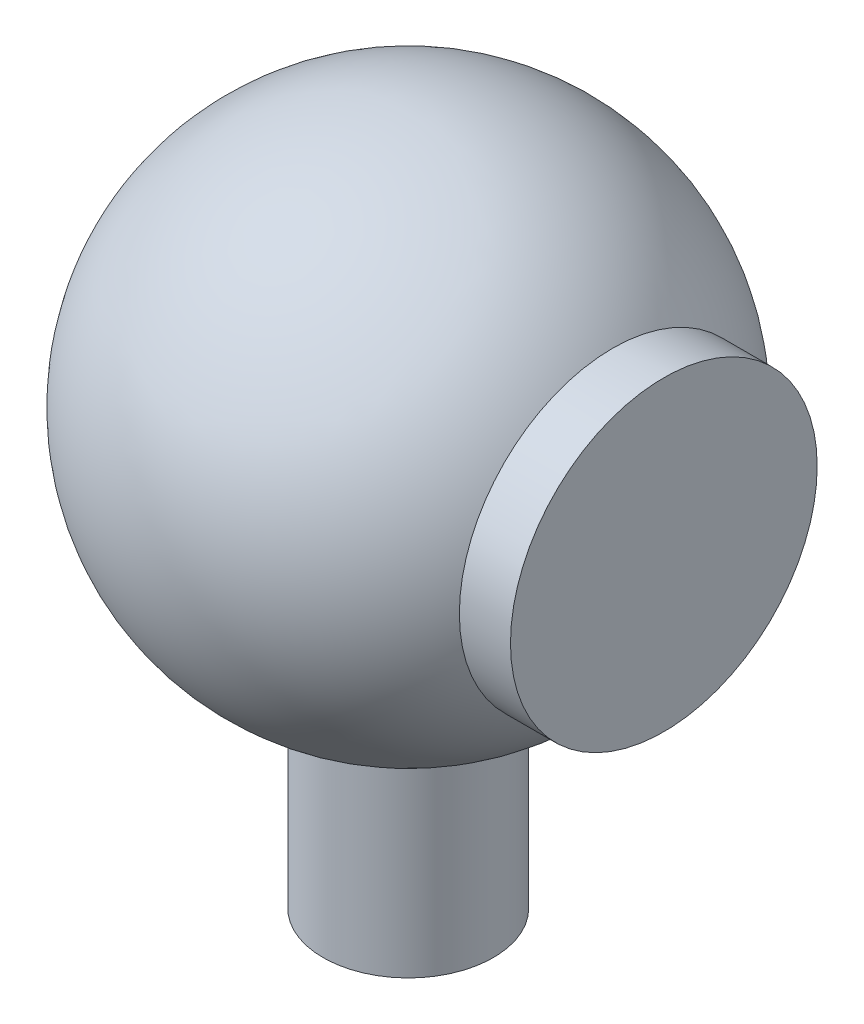
ISO-10303-21;
HEADER;
FILE_DESCRIPTION(('STEP AP214'),'2;1');
FILE_NAME('part.step','',(''),(''),'','','');
FILE_SCHEMA(('AUTOMOTIVE_DESIGN { 1 0 10303 214 1 1 1 1 }'));
ENDSEC;
DATA;
#1=APPLICATION_CONTEXT('core data for automotive mechanical design processes');
#2=APPLICATION_PROTOCOL_DEFINITION('international standard','automotive_design',2000,#1);
#3=PRODUCT_CONTEXT('',#1,'mechanical');
#4=PRODUCT('Part','Part','',(#3));
#5=PRODUCT_RELATED_PRODUCT_CATEGORY('part','',(#4));
#6=PRODUCT_DEFINITION_FORMATION('','',#4);
#7=PRODUCT_DEFINITION_CONTEXT('part definition',#1,'design');
#8=PRODUCT_DEFINITION('design','',#6,#7);
#9=PRODUCT_DEFINITION_SHAPE('','',#8);
#10=(LENGTH_UNIT() NAMED_UNIT(*) SI_UNIT(.MILLI.,.METRE.));
#11=(NAMED_UNIT(*) PLANE_ANGLE_UNIT() SI_UNIT($,.RADIAN.));
#12=(NAMED_UNIT(*) SI_UNIT($,.STERADIAN.) SOLID_ANGLE_UNIT());
#13=UNCERTAINTY_MEASURE_WITH_UNIT(LENGTH_MEASURE(1.E-05),#10,'distance_accuracy_value','');
#14=(GEOMETRIC_REPRESENTATION_CONTEXT(3) GLOBAL_UNCERTAINTY_ASSIGNED_CONTEXT((#13)) GLOBAL_UNIT_ASSIGNED_CONTEXT((#10,
#11,#12)) REPRESENTATION_CONTEXT('',''));
#15=CARTESIAN_POINT('',(0.,0.,0.));
#16=DIRECTION('',(0.,0.,1.));
#17=DIRECTION('',(1.,0.,0.));
#18=AXIS2_PLACEMENT_3D('',#15,#16,#17);
#19=CARTESIAN_POINT('',(0.,0.,0.));
#20=DIRECTION('',(-1.,0.,0.));
#21=DIRECTION('',(0.,1.,0.));
#22=AXIS2_PLACEMENT_3D('',#19,#20,#21);
#23=SPHERICAL_SURFACE('',#22,22.5);
#24=CARTESIAN_POINT('',(18.,0.,0.));
#25=DIRECTION('',(-1.,0.,0.));
#26=DIRECTION('',(0.,0.,1.));
#27=AXIS2_PLACEMENT_3D('',#24,#25,#26);
#28=CIRCLE('',#27,13.5);
#29=CARTESIAN_POINT('',(18.,0.,13.5));
#30=VERTEX_POINT('',#29);
#31=EDGE_CURVE('E12',#30,#30,#28,.T.);
#32=ORIENTED_EDGE('',*,*,#31,.T.);
#33=EDGE_LOOP('',(#32));
#34=FACE_BOUND('',#33,.T.);
#35=CARTESIAN_POINT('',(0.,-21.2132034355964,0.));
#36=DIRECTION('',(0.,1.,0.));
#37=DIRECTION('',(-1.,0.,0.));
#38=AXIS2_PLACEMENT_3D('',#35,#36,#37);
#39=CIRCLE('',#38,7.5);
#40=CARTESIAN_POINT('',(-7.5,-21.2132034355964,0.));
#41=VERTEX_POINT('',#40);
#42=EDGE_CURVE('E57',#41,#41,#39,.T.);
#43=ORIENTED_EDGE('',*,*,#42,.T.);
#44=EDGE_LOOP('',(#43));
#45=FACE_BOUND('',#44,.T.);
#46=ADVANCED_FACE('F43',(#34,#45),#23,.T.);
#47=CARTESIAN_POINT('',(0.,0.,0.));
#48=DIRECTION('',(-1.,0.,0.));
#49=DIRECTION('',(0.,0.,1.));
#50=AXIS2_PLACEMENT_3D('',#47,#48,#49);
#51=CYLINDRICAL_SURFACE('',#50,13.5);
#52=CARTESIAN_POINT('',(22.5,0.,0.));
#53=DIRECTION('',(-1.,0.,0.));
#54=DIRECTION('',(0.,0.,1.));
#55=AXIS2_PLACEMENT_3D('',#52,#53,#54);
#56=CIRCLE('',#55,13.5);
#57=CARTESIAN_POINT('',(22.5,0.,13.5));
#58=VERTEX_POINT('',#57);
#59=EDGE_CURVE('E49',#58,#58,#56,.T.);
#60=ORIENTED_EDGE('',*,*,#59,.T.);
#61=EDGE_LOOP('',(#60));
#62=FACE_BOUND('',#61,.T.);
#63=ORIENTED_EDGE('',*,*,#31,.F.);
#64=EDGE_LOOP('',(#63));
#65=FACE_BOUND('',#64,.T.);
#66=ADVANCED_FACE('F77',(#62,#65),#51,.T.);
#67=CARTESIAN_POINT('',(22.5,-13.5,0.));
#68=DIRECTION('',(1.,0.,0.));
#69=DIRECTION('',(0.,0.,-1.));
#70=AXIS2_PLACEMENT_3D('',#67,#68,#69);
#71=PLANE('',#70);
#72=ORIENTED_EDGE('',*,*,#59,.F.);
#73=EDGE_LOOP('',(#72));
#74=FACE_BOUND('',#73,.T.);
#75=ADVANCED_FACE('F72',(#74),#71,.T.);
#76=CARTESIAN_POINT('',(0.,-38.2132034355964,0.));
#77=DIRECTION('',(0.,1.,0.));
#78=DIRECTION('',(-1.,0.,0.));
#79=AXIS2_PLACEMENT_3D('',#76,#77,#78);
#80=PLANE('',#79);
#81=CARTESIAN_POINT('',(0.,-38.2132034355964,0.));
#82=DIRECTION('',(0.,1.,0.));
#83=DIRECTION('',(-1.,0.,0.));
#84=AXIS2_PLACEMENT_3D('',#81,#82,#83);
#85=CIRCLE('',#84,7.5);
#86=CARTESIAN_POINT('',(-7.5,-38.2132034355964,0.));
#87=VERTEX_POINT('',#86);
#88=EDGE_CURVE('E53',#87,#87,#85,.T.);
#89=ORIENTED_EDGE('',*,*,#88,.F.);
#90=EDGE_LOOP('',(#89));
#91=FACE_BOUND('',#90,.T.);
#92=ADVANCED_FACE('F67',(#91),#80,.F.);
#93=CARTESIAN_POINT('',(0.,-21.2132034355964,0.));
#94=DIRECTION('',(0.,1.,0.));
#95=DIRECTION('',(-1.,0.,0.));
#96=AXIS2_PLACEMENT_3D('',#93,#94,#95);
#97=CYLINDRICAL_SURFACE('',#96,7.5);
#98=ORIENTED_EDGE('',*,*,#42,.F.);
#99=EDGE_LOOP('',(#98));
#100=FACE_BOUND('',#99,.T.);
#101=ORIENTED_EDGE('',*,*,#88,.T.);
#102=EDGE_LOOP('',(#101));
#103=FACE_BOUND('',#102,.T.);
#104=ADVANCED_FACE('F64',(#100,#103),#97,.T.);
#105=CLOSED_SHELL('',(#46,#66,#75,#92,#104));
#106=MANIFOLD_SOLID_BREP('B2',#105);
#107=ADVANCED_BREP_SHAPE_REPRESENTATION('',(#18,#106),#14);
#108=SHAPE_DEFINITION_REPRESENTATION(#9,#107);
ENDSEC;
END-ISO-10303-21;
